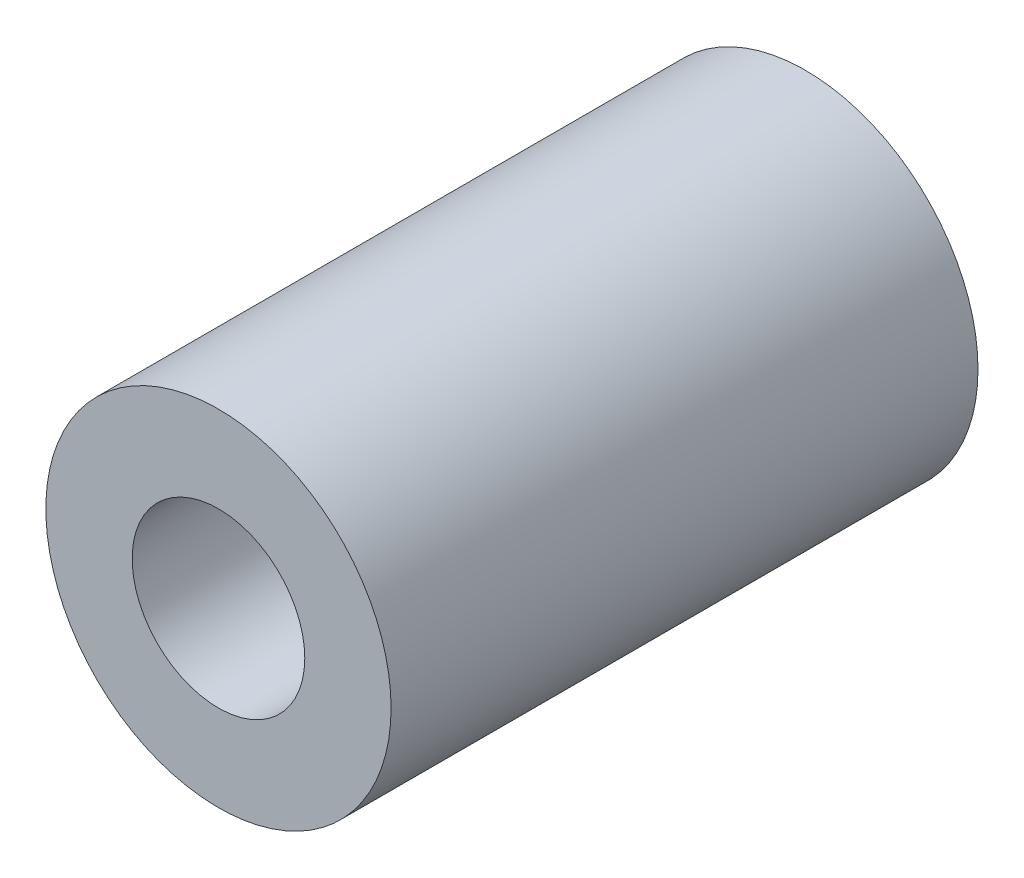
ISO-10303-21;
HEADER;
FILE_DESCRIPTION(('STEP AP214'),'2;1');
FILE_NAME('part.step','',(''),(''),'','','');
FILE_SCHEMA(('AUTOMOTIVE_DESIGN { 1 0 10303 214 1 1 1 1 }'));
ENDSEC;
DATA;
#1=APPLICATION_CONTEXT('core data for automotive mechanical design processes');
#2=APPLICATION_PROTOCOL_DEFINITION('international standard','automotive_design',2000,#1);
#3=PRODUCT_CONTEXT('',#1,'mechanical');
#4=PRODUCT('Part','Part','',(#3));
#5=PRODUCT_RELATED_PRODUCT_CATEGORY('part','',(#4));
#6=PRODUCT_DEFINITION_FORMATION('','',#4);
#7=PRODUCT_DEFINITION_CONTEXT('part definition',#1,'design');
#8=PRODUCT_DEFINITION('design','',#6,#7);
#9=PRODUCT_DEFINITION_SHAPE('','',#8);
#10=(LENGTH_UNIT() NAMED_UNIT(*) SI_UNIT(.MILLI.,.METRE.));
#11=(NAMED_UNIT(*) PLANE_ANGLE_UNIT() SI_UNIT($,.RADIAN.));
#12=(NAMED_UNIT(*) SI_UNIT($,.STERADIAN.) SOLID_ANGLE_UNIT());
#13=UNCERTAINTY_MEASURE_WITH_UNIT(LENGTH_MEASURE(1.E-05),#10,'distance_accuracy_value','');
#14=(GEOMETRIC_REPRESENTATION_CONTEXT(3) GLOBAL_UNCERTAINTY_ASSIGNED_CONTEXT((#13)) GLOBAL_UNIT_ASSIGNED_CONTEXT((#10,
#11,#12)) REPRESENTATION_CONTEXT('',''));
#15=CARTESIAN_POINT('',(0.,0.,0.));
#16=DIRECTION('',(0.,0.,1.));
#17=DIRECTION('',(1.,0.,0.));
#18=AXIS2_PLACEMENT_3D('',#15,#16,#17);
#19=CARTESIAN_POINT('',(0.,0.,170.));
#20=DIRECTION('',(0.,0.,1.));
#21=DIRECTION('',(1.,0.,0.));
#22=AXIS2_PLACEMENT_3D('',#19,#20,#21);
#23=PLANE('',#22);
#24=CARTESIAN_POINT('',(0.,0.,170.));
#25=DIRECTION('',(0.,0.,1.));
#26=DIRECTION('',(1.,0.,0.));
#27=AXIS2_PLACEMENT_3D('',#24,#25,#26);
#28=CIRCLE('',#27,50.);
#29=CARTESIAN_POINT('',(50.,0.,170.));
#30=VERTEX_POINT('',#29);
#31=EDGE_CURVE('E10',#30,#30,#28,.T.);
#32=ORIENTED_EDGE('',*,*,#31,.T.);
#33=EDGE_LOOP('',(#32));
#34=FACE_BOUND('',#33,.T.);
#35=CARTESIAN_POINT('',(0.,0.,170.));
#36=DIRECTION('',(0.,0.,1.));
#37=DIRECTION('',(1.,0.,0.));
#38=AXIS2_PLACEMENT_3D('',#35,#36,#37);
#39=CIRCLE('',#38,25.);
#40=CARTESIAN_POINT('',(25.,0.,170.));
#41=VERTEX_POINT('',#40);
#42=EDGE_CURVE('E48',#41,#41,#39,.T.);
#43=ORIENTED_EDGE('',*,*,#42,.F.);
#44=EDGE_LOOP('',(#43));
#45=FACE_BOUND('',#44,.T.);
#46=ADVANCED_FACE('F37',(#34,#45),#23,.T.);
#47=CARTESIAN_POINT('',(0.,0.,0.));
#48=DIRECTION('',(0.,0.,1.));
#49=DIRECTION('',(1.,0.,0.));
#50=AXIS2_PLACEMENT_3D('',#47,#48,#49);
#51=PLANE('',#50);
#52=CARTESIAN_POINT('',(0.,0.,0.));
#53=DIRECTION('',(0.,0.,1.));
#54=DIRECTION('',(1.,0.,0.));
#55=AXIS2_PLACEMENT_3D('',#52,#53,#54);
#56=CIRCLE('',#55,50.);
#57=CARTESIAN_POINT('',(50.,0.,0.));
#58=VERTEX_POINT('',#57);
#59=EDGE_CURVE('E41',#58,#58,#56,.T.);
#60=ORIENTED_EDGE('',*,*,#59,.F.);
#61=EDGE_LOOP('',(#60));
#62=FACE_BOUND('',#61,.T.);
#63=CARTESIAN_POINT('',(0.,0.,0.));
#64=DIRECTION('',(0.,0.,1.));
#65=DIRECTION('',(1.,0.,0.));
#66=AXIS2_PLACEMENT_3D('',#63,#64,#65);
#67=CIRCLE('',#66,25.);
#68=CARTESIAN_POINT('',(25.,0.,0.));
#69=VERTEX_POINT('',#68);
#70=EDGE_CURVE('E50',#69,#69,#67,.T.);
#71=ORIENTED_EDGE('',*,*,#70,.T.);
#72=EDGE_LOOP('',(#71));
#73=FACE_BOUND('',#72,.T.);
#74=ADVANCED_FACE('F60',(#62,#73),#51,.F.);
#75=CARTESIAN_POINT('',(0.,0.,170.));
#76=DIRECTION('',(0.,0.,-1.));
#77=DIRECTION('',(-1.,0.,0.));
#78=AXIS2_PLACEMENT_3D('',#75,#76,#77);
#79=CYLINDRICAL_SURFACE('',#78,50.);
#80=ORIENTED_EDGE('',*,*,#31,.F.);
#81=EDGE_LOOP('',(#80));
#82=FACE_BOUND('',#81,.T.);
#83=ORIENTED_EDGE('',*,*,#59,.T.);
#84=EDGE_LOOP('',(#83));
#85=FACE_BOUND('',#84,.T.);
#86=ADVANCED_FACE('F39',(#82,#85),#79,.T.);
#87=CARTESIAN_POINT('',(0.,0.,170.));
#88=DIRECTION('',(0.,0.,-1.));
#89=DIRECTION('',(-1.,0.,0.));
#90=AXIS2_PLACEMENT_3D('',#87,#88,#89);
#91=CYLINDRICAL_SURFACE('',#90,25.);
#92=ORIENTED_EDGE('',*,*,#42,.T.);
#93=EDGE_LOOP('',(#92));
#94=FACE_BOUND('',#93,.T.);
#95=ORIENTED_EDGE('',*,*,#70,.F.);
#96=EDGE_LOOP('',(#95));
#97=FACE_BOUND('',#96,.T.);
#98=ADVANCED_FACE('F56',(#94,#97),#91,.F.);
#99=CLOSED_SHELL('',(#46,#74,#86,#98));
#100=MANIFOLD_SOLID_BREP('B2',#99);
#101=ADVANCED_BREP_SHAPE_REPRESENTATION('',(#18,#100),#14);
#102=SHAPE_DEFINITION_REPRESENTATION(#9,#101);
ENDSEC;
END-ISO-10303-21;
